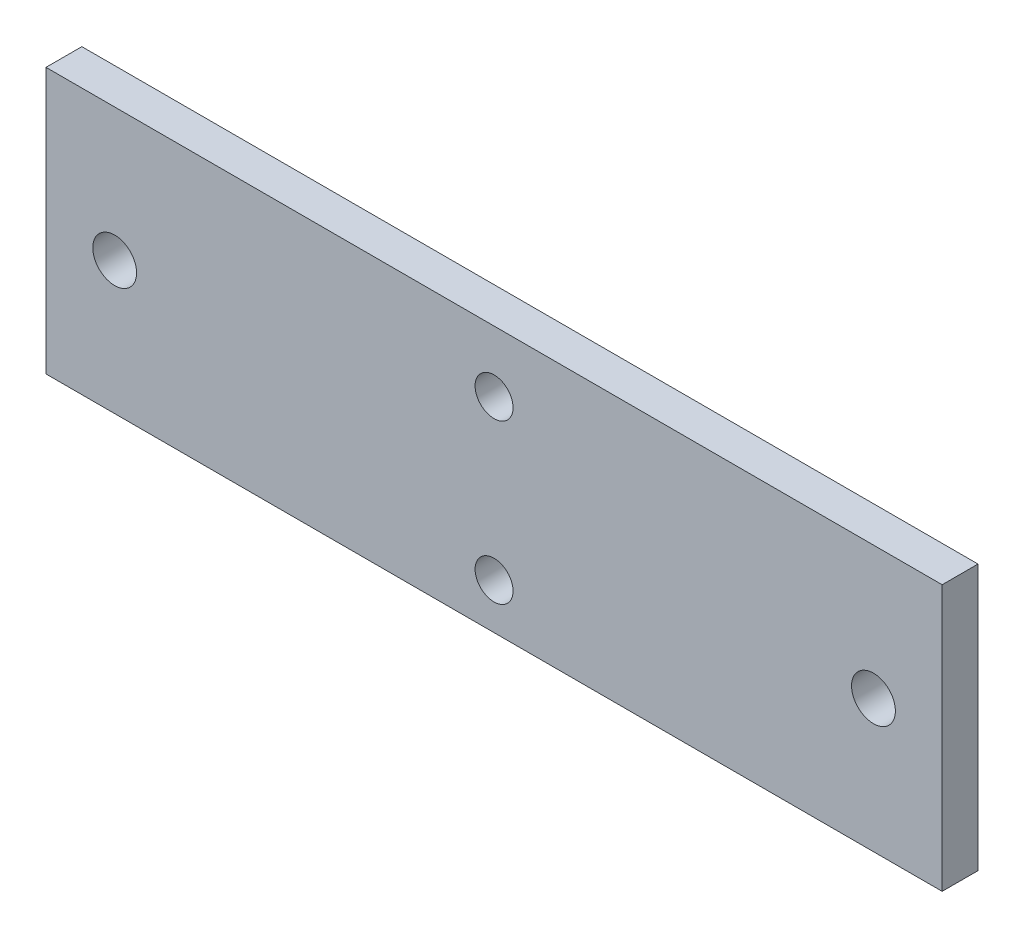
ISO-10303-21;
HEADER;
FILE_DESCRIPTION(('STEP AP214'),'2;1');
FILE_NAME('part.step','',(''),(''),'','','');
FILE_SCHEMA(('AUTOMOTIVE_DESIGN { 1 0 10303 214 1 1 1 1 }'));
ENDSEC;
DATA;
#1=APPLICATION_CONTEXT('core data for automotive mechanical design processes');
#2=APPLICATION_PROTOCOL_DEFINITION('international standard','automotive_design',2000,#1);
#3=PRODUCT_CONTEXT('',#1,'mechanical');
#4=PRODUCT('Part','Part','',(#3));
#5=PRODUCT_RELATED_PRODUCT_CATEGORY('part','',(#4));
#6=PRODUCT_DEFINITION_FORMATION('','',#4);
#7=PRODUCT_DEFINITION_CONTEXT('part definition',#1,'design');
#8=PRODUCT_DEFINITION('design','',#6,#7);
#9=PRODUCT_DEFINITION_SHAPE('','',#8);
#10=(LENGTH_UNIT() NAMED_UNIT(*) SI_UNIT(.MILLI.,.METRE.));
#11=(NAMED_UNIT(*) PLANE_ANGLE_UNIT() SI_UNIT($,.RADIAN.));
#12=(NAMED_UNIT(*) SI_UNIT($,.STERADIAN.) SOLID_ANGLE_UNIT());
#13=UNCERTAINTY_MEASURE_WITH_UNIT(LENGTH_MEASURE(1.E-05),#10,'distance_accuracy_value','');
#14=(GEOMETRIC_REPRESENTATION_CONTEXT(3) GLOBAL_UNCERTAINTY_ASSIGNED_CONTEXT((#13)) GLOBAL_UNIT_ASSIGNED_CONTEXT((#10,
#11,#12)) REPRESENTATION_CONTEXT('',''));
#15=CARTESIAN_POINT('',(0.,0.,0.));
#16=DIRECTION('',(0.,0.,1.));
#17=DIRECTION('',(1.,0.,0.));
#18=AXIS2_PLACEMENT_3D('',#15,#16,#17);
#19=CARTESIAN_POINT('',(0.,0.,6.));
#20=DIRECTION('',(1.,0.,0.));
#21=DIRECTION('',(0.,0.,-1.));
#22=AXIS2_PLACEMENT_3D('',#19,#20,#21);
#23=PLANE('',#22);
#24=DIRECTION('',(0.,-1.,0.));
#25=VECTOR('',#24,1.);
#26=CARTESIAN_POINT('',(0.,0.,0.));
#27=LINE('',#26,#25);
#28=CARTESIAN_POINT('',(0.,44.45,0.));
#29=VERTEX_POINT('',#28);
#30=CARTESIAN_POINT('',(0.,0.,0.));
#31=VERTEX_POINT('',#30);
#32=EDGE_CURVE('E101',#29,#31,#27,.T.);
#33=ORIENTED_EDGE('',*,*,#32,.T.);
#34=DIRECTION('',(0.,0.,-1.));
#35=VECTOR('',#34,1.);
#36=CARTESIAN_POINT('',(0.,0.,6.));
#37=LINE('',#36,#35);
#38=CARTESIAN_POINT('',(0.,0.,6.));
#39=VERTEX_POINT('',#38);
#40=EDGE_CURVE('E11',#39,#31,#37,.T.);
#41=ORIENTED_EDGE('',*,*,#40,.F.);
#42=DIRECTION('',(0.,-1.,0.));
#43=VECTOR('',#42,1.);
#44=CARTESIAN_POINT('',(0.,0.,6.));
#45=LINE('',#44,#43);
#46=CARTESIAN_POINT('',(0.,44.45,6.));
#47=VERTEX_POINT('',#46);
#48=EDGE_CURVE('E89',#47,#39,#45,.T.);
#49=ORIENTED_EDGE('',*,*,#48,.F.);
#50=DIRECTION('',(0.,0.,-1.));
#51=VECTOR('',#50,1.);
#52=CARTESIAN_POINT('',(0.,44.45,6.));
#53=LINE('',#52,#51);
#54=EDGE_CURVE('E97',#47,#29,#53,.T.);
#55=ORIENTED_EDGE('',*,*,#54,.T.);
#56=EDGE_LOOP('',(#33,#41,#49,#55));
#57=FACE_BOUND('',#56,.T.);
#58=ADVANCED_FACE('F38',(#57),#23,.F.);
#59=CARTESIAN_POINT('',(0.,0.,6.));
#60=DIRECTION('',(0.,1.,0.));
#61=DIRECTION('',(0.,0.,1.));
#62=AXIS2_PLACEMENT_3D('',#59,#60,#61);
#63=PLANE('',#62);
#64=DIRECTION('',(1.,0.,0.));
#65=VECTOR('',#64,1.);
#66=CARTESIAN_POINT('',(0.,0.,0.));
#67=LINE('',#66,#65);
#68=CARTESIAN_POINT('',(150.,0.,0.));
#69=VERTEX_POINT('',#68);
#70=EDGE_CURVE('E93',#31,#69,#67,.T.);
#71=ORIENTED_EDGE('',*,*,#70,.T.);
#72=DIRECTION('',(0.,0.,-1.));
#73=VECTOR('',#72,1.);
#74=CARTESIAN_POINT('',(150.,0.,6.));
#75=LINE('',#74,#73);
#76=CARTESIAN_POINT('',(150.,0.,6.));
#77=VERTEX_POINT('',#76);
#78=EDGE_CURVE('E46',#77,#69,#75,.T.);
#79=ORIENTED_EDGE('',*,*,#78,.F.);
#80=DIRECTION('',(1.,0.,0.));
#81=VECTOR('',#80,1.);
#82=CARTESIAN_POINT('',(0.,0.,6.));
#83=LINE('',#82,#81);
#84=EDGE_CURVE('E84',#39,#77,#83,.T.);
#85=ORIENTED_EDGE('',*,*,#84,.F.);
#86=ORIENTED_EDGE('',*,*,#40,.T.);
#87=EDGE_LOOP('',(#71,#79,#85,#86));
#88=FACE_BOUND('',#87,.T.);
#89=ADVANCED_FACE('F92',(#88),#63,.F.);
#90=CARTESIAN_POINT('',(150.,0.,6.));
#91=DIRECTION('',(-1.,0.,0.));
#92=DIRECTION('',(0.,0.,1.));
#93=AXIS2_PLACEMENT_3D('',#90,#91,#92);
#94=PLANE('',#93);
#95=DIRECTION('',(0.,1.,0.));
#96=VECTOR('',#95,1.);
#97=CARTESIAN_POINT('',(150.,0.,0.));
#98=LINE('',#97,#96);
#99=CARTESIAN_POINT('',(150.,44.45,0.));
#100=VERTEX_POINT('',#99);
#101=EDGE_CURVE('E71',#69,#100,#98,.T.);
#102=ORIENTED_EDGE('',*,*,#101,.T.);
#103=DIRECTION('',(0.,0.,-1.));
#104=VECTOR('',#103,1.);
#105=CARTESIAN_POINT('',(150.,44.45,6.));
#106=LINE('',#105,#104);
#107=CARTESIAN_POINT('',(150.,44.45,6.));
#108=VERTEX_POINT('',#107);
#109=EDGE_CURVE('E94',#108,#100,#106,.T.);
#110=ORIENTED_EDGE('',*,*,#109,.F.);
#111=DIRECTION('',(0.,1.,0.));
#112=VECTOR('',#111,1.);
#113=CARTESIAN_POINT('',(150.,0.,6.));
#114=LINE('',#113,#112);
#115=EDGE_CURVE('E87',#77,#108,#114,.T.);
#116=ORIENTED_EDGE('',*,*,#115,.F.);
#117=ORIENTED_EDGE('',*,*,#78,.T.);
#118=EDGE_LOOP('',(#102,#110,#116,#117));
#119=FACE_BOUND('',#118,.T.);
#120=ADVANCED_FACE('F95',(#119),#94,.F.);
#121=CARTESIAN_POINT('',(0.,44.45,6.));
#122=DIRECTION('',(0.,-1.,0.));
#123=DIRECTION('',(0.,0.,-1.));
#124=AXIS2_PLACEMENT_3D('',#121,#122,#123);
#125=PLANE('',#124);
#126=DIRECTION('',(-1.,0.,0.));
#127=VECTOR('',#126,1.);
#128=CARTESIAN_POINT('',(0.,44.45,0.));
#129=LINE('',#128,#127);
#130=EDGE_CURVE('E77',#100,#29,#129,.T.);
#131=ORIENTED_EDGE('',*,*,#130,.T.);
#132=ORIENTED_EDGE('',*,*,#54,.F.);
#133=DIRECTION('',(-1.,0.,0.));
#134=VECTOR('',#133,1.);
#135=CARTESIAN_POINT('',(0.,44.45,6.));
#136=LINE('',#135,#134);
#137=EDGE_CURVE('E54',#108,#47,#136,.T.);
#138=ORIENTED_EDGE('',*,*,#137,.F.);
#139=ORIENTED_EDGE('',*,*,#109,.T.);
#140=EDGE_LOOP('',(#131,#132,#138,#139));
#141=FACE_BOUND('',#140,.T.);
#142=ADVANCED_FACE('F109',(#141),#125,.F.);
#143=CARTESIAN_POINT('',(0.,0.,6.));
#144=DIRECTION('',(0.,0.,-1.));
#145=DIRECTION('',(-1.,0.,0.));
#146=AXIS2_PLACEMENT_3D('',#143,#144,#145);
#147=PLANE('',#146);
#148=CARTESIAN_POINT('',(75.,7.61999999999999,6.));
#149=DIRECTION('',(0.,0.,-1.));
#150=DIRECTION('',(-1.,0.,0.));
#151=AXIS2_PLACEMENT_3D('',#148,#149,#150);
#152=CIRCLE('',#151,3.175);
#153=CARTESIAN_POINT('',(71.825,7.61999999999999,6.));
#154=VERTEX_POINT('',#153);
#155=EDGE_CURVE('E119',#154,#154,#152,.T.);
#156=ORIENTED_EDGE('',*,*,#155,.T.);
#157=EDGE_LOOP('',(#156));
#158=FACE_BOUND('',#157,.T.);
#159=CARTESIAN_POINT('',(75.,34.1979950363154,6.));
#160=DIRECTION('',(0.,0.,-1.));
#161=DIRECTION('',(-1.,0.,0.));
#162=AXIS2_PLACEMENT_3D('',#159,#160,#161);
#163=CIRCLE('',#162,3.175);
#164=CARTESIAN_POINT('',(71.825,34.1979950363154,6.));
#165=VERTEX_POINT('',#164);
#166=EDGE_CURVE('E130',#165,#165,#163,.T.);
#167=ORIENTED_EDGE('',*,*,#166,.T.);
#168=EDGE_LOOP('',(#167));
#169=FACE_BOUND('',#168,.T.);
#170=CARTESIAN_POINT('',(11.495,22.225,6.));
#171=DIRECTION('',(0.,0.,1.));
#172=DIRECTION('',(1.,0.,0.));
#173=AXIS2_PLACEMENT_3D('',#170,#171,#172);
#174=CIRCLE('',#173,3.66617420935412);
#175=CARTESIAN_POINT('',(15.1611742093541,22.225,6.));
#176=VERTEX_POINT('',#175);
#177=EDGE_CURVE('E122',#176,#176,#174,.T.);
#178=ORIENTED_EDGE('',*,*,#177,.F.);
#179=EDGE_LOOP('',(#178));
#180=FACE_BOUND('',#179,.T.);
#181=CARTESIAN_POINT('',(138.505,22.225,6.));
#182=DIRECTION('',(0.,0.,1.));
#183=DIRECTION('',(-1.,0.,0.));
#184=AXIS2_PLACEMENT_3D('',#181,#182,#183);
#185=CIRCLE('',#184,3.6661742093541);
#186=CARTESIAN_POINT('',(134.838825790646,22.225,6.));
#187=VERTEX_POINT('',#186);
#188=EDGE_CURVE('E115',#187,#187,#185,.T.);
#189=ORIENTED_EDGE('',*,*,#188,.F.);
#190=EDGE_LOOP('',(#189));
#191=FACE_BOUND('',#190,.T.);
#192=ORIENTED_EDGE('',*,*,#48,.T.);
#193=ORIENTED_EDGE('',*,*,#84,.T.);
#194=ORIENTED_EDGE('',*,*,#115,.T.);
#195=ORIENTED_EDGE('',*,*,#137,.T.);
#196=EDGE_LOOP('',(#192,#193,#194,#195));
#197=FACE_BOUND('',#196,.T.);
#198=ADVANCED_FACE('F85',(#158,#169,#180,#191,#197),#147,.F.);
#199=CARTESIAN_POINT('',(0.,0.,0.));
#200=DIRECTION('',(0.,0.,-1.));
#201=DIRECTION('',(-1.,0.,0.));
#202=AXIS2_PLACEMENT_3D('',#199,#200,#201);
#203=PLANE('',#202);
#204=CARTESIAN_POINT('',(75.,7.61999999999999,0.));
#205=DIRECTION('',(0.,0.,-1.));
#206=DIRECTION('',(-1.,0.,0.));
#207=AXIS2_PLACEMENT_3D('',#204,#205,#206);
#208=CIRCLE('',#207,3.175);
#209=CARTESIAN_POINT('',(71.825,7.61999999999999,0.));
#210=VERTEX_POINT('',#209);
#211=EDGE_CURVE('E133',#210,#210,#208,.T.);
#212=ORIENTED_EDGE('',*,*,#211,.F.);
#213=EDGE_LOOP('',(#212));
#214=FACE_BOUND('',#213,.T.);
#215=CARTESIAN_POINT('',(75.,34.1979950363154,0.));
#216=DIRECTION('',(0.,0.,-1.));
#217=DIRECTION('',(-1.,0.,0.));
#218=AXIS2_PLACEMENT_3D('',#215,#216,#217);
#219=CIRCLE('',#218,3.175);
#220=CARTESIAN_POINT('',(71.825,34.1979950363154,0.));
#221=VERTEX_POINT('',#220);
#222=EDGE_CURVE('E127',#221,#221,#219,.T.);
#223=ORIENTED_EDGE('',*,*,#222,.F.);
#224=EDGE_LOOP('',(#223));
#225=FACE_BOUND('',#224,.T.);
#226=CARTESIAN_POINT('',(11.495,22.225,0.));
#227=DIRECTION('',(0.,0.,1.));
#228=DIRECTION('',(1.,0.,0.));
#229=AXIS2_PLACEMENT_3D('',#226,#227,#228);
#230=CIRCLE('',#229,3.66617420935412);
#231=CARTESIAN_POINT('',(15.1611742093541,22.225,0.));
#232=VERTEX_POINT('',#231);
#233=EDGE_CURVE('E104',#232,#232,#230,.T.);
#234=ORIENTED_EDGE('',*,*,#233,.T.);
#235=EDGE_LOOP('',(#234));
#236=FACE_BOUND('',#235,.T.);
#237=CARTESIAN_POINT('',(138.505,22.225,0.));
#238=DIRECTION('',(0.,0.,1.));
#239=DIRECTION('',(-1.,0.,0.));
#240=AXIS2_PLACEMENT_3D('',#237,#238,#239);
#241=CIRCLE('',#240,3.6661742093541);
#242=CARTESIAN_POINT('',(134.838825790646,22.225,0.));
#243=VERTEX_POINT('',#242);
#244=EDGE_CURVE('E118',#243,#243,#241,.T.);
#245=ORIENTED_EDGE('',*,*,#244,.T.);
#246=EDGE_LOOP('',(#245));
#247=FACE_BOUND('',#246,.T.);
#248=ORIENTED_EDGE('',*,*,#32,.F.);
#249=ORIENTED_EDGE('',*,*,#130,.F.);
#250=ORIENTED_EDGE('',*,*,#101,.F.);
#251=ORIENTED_EDGE('',*,*,#70,.F.);
#252=EDGE_LOOP('',(#248,#249,#250,#251));
#253=FACE_BOUND('',#252,.T.);
#254=ADVANCED_FACE('F112',(#214,#225,#236,#247,#253),#203,.T.);
#255=CARTESIAN_POINT('',(138.505,22.225,0.));
#256=DIRECTION('',(0.,0.,1.));
#257=DIRECTION('',(1.,0.,0.));
#258=AXIS2_PLACEMENT_3D('',#255,#256,#257);
#259=CYLINDRICAL_SURFACE('',#258,3.6661742093541);
#260=ORIENTED_EDGE('',*,*,#244,.F.);
#261=EDGE_LOOP('',(#260));
#262=FACE_BOUND('',#261,.T.);
#263=ORIENTED_EDGE('',*,*,#188,.T.);
#264=EDGE_LOOP('',(#263));
#265=FACE_BOUND('',#264,.T.);
#266=ADVANCED_FACE('F150',(#262,#265),#259,.F.);
#267=CARTESIAN_POINT('',(11.495,22.225,0.));
#268=DIRECTION('',(0.,0.,1.));
#269=DIRECTION('',(1.,0.,0.));
#270=AXIS2_PLACEMENT_3D('',#267,#268,#269);
#271=CYLINDRICAL_SURFACE('',#270,3.66617420935412);
#272=ORIENTED_EDGE('',*,*,#233,.F.);
#273=EDGE_LOOP('',(#272));
#274=FACE_BOUND('',#273,.T.);
#275=ORIENTED_EDGE('',*,*,#177,.T.);
#276=EDGE_LOOP('',(#275));
#277=FACE_BOUND('',#276,.T.);
#278=ADVANCED_FACE('F160',(#274,#277),#271,.F.);
#279=CARTESIAN_POINT('',(75.,34.1979950363154,6.));
#280=DIRECTION('',(0.,0.,-1.));
#281=DIRECTION('',(-1.,0.,0.));
#282=AXIS2_PLACEMENT_3D('',#279,#280,#281);
#283=CYLINDRICAL_SURFACE('',#282,3.175);
#284=ORIENTED_EDGE('',*,*,#166,.F.);
#285=EDGE_LOOP('',(#284));
#286=FACE_BOUND('',#285,.T.);
#287=ORIENTED_EDGE('',*,*,#222,.T.);
#288=EDGE_LOOP('',(#287));
#289=FACE_BOUND('',#288,.T.);
#290=ADVANCED_FACE('F144',(#286,#289),#283,.F.);
#291=CARTESIAN_POINT('',(75.,7.61999999999999,6.));
#292=DIRECTION('',(0.,0.,-1.));
#293=DIRECTION('',(-1.,0.,0.));
#294=AXIS2_PLACEMENT_3D('',#291,#292,#293);
#295=CYLINDRICAL_SURFACE('',#294,3.175);
#296=ORIENTED_EDGE('',*,*,#155,.F.);
#297=EDGE_LOOP('',(#296));
#298=FACE_BOUND('',#297,.T.);
#299=ORIENTED_EDGE('',*,*,#211,.T.);
#300=EDGE_LOOP('',(#299));
#301=FACE_BOUND('',#300,.T.);
#302=ADVANCED_FACE('F141',(#298,#301),#295,.F.);
#303=CLOSED_SHELL('',(#58,#89,#120,#142,#198,#254,#266,#278,#290,#302));
#304=MANIFOLD_SOLID_BREP('B2',#303);
#305=ADVANCED_BREP_SHAPE_REPRESENTATION('',(#18,#304),#14);
#306=SHAPE_DEFINITION_REPRESENTATION(#9,#305);
ENDSEC;
END-ISO-10303-21;
